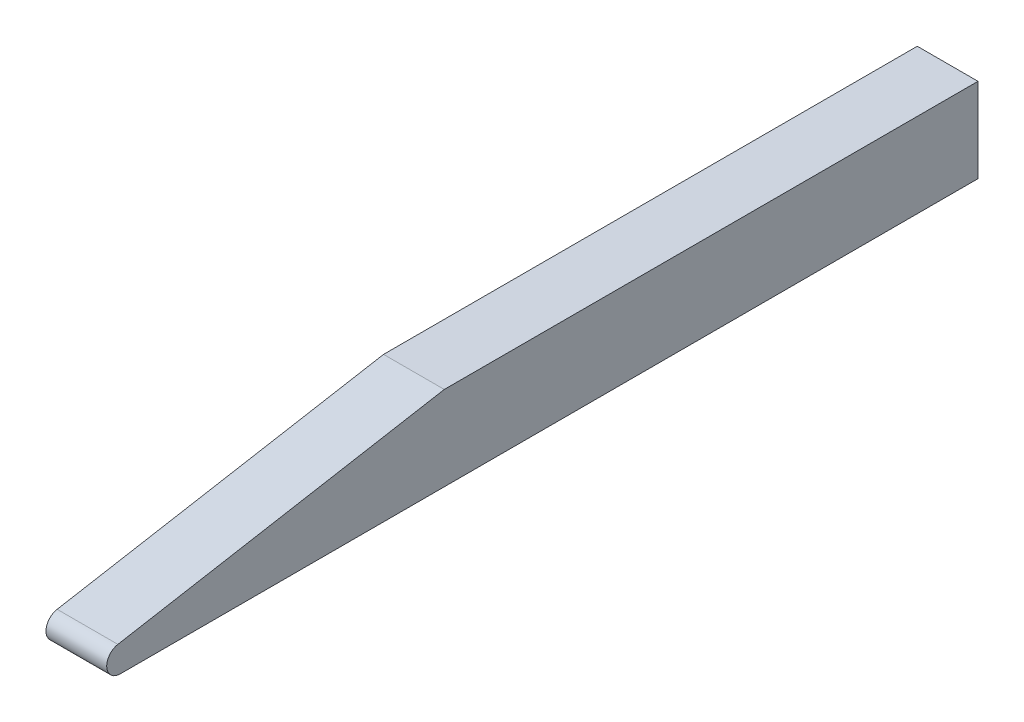
ISO-10303-21;
HEADER;
FILE_DESCRIPTION(('STEP AP214'),'2;1');
FILE_NAME('part.step','',(''),(''),'','','');
FILE_SCHEMA(('AUTOMOTIVE_DESIGN { 1 0 10303 214 1 1 1 1 }'));
ENDSEC;
DATA;
#1=APPLICATION_CONTEXT('core data for automotive mechanical design processes');
#2=APPLICATION_PROTOCOL_DEFINITION('international standard','automotive_design',2000,#1);
#3=PRODUCT_CONTEXT('',#1,'mechanical');
#4=PRODUCT('Part','Part','',(#3));
#5=PRODUCT_RELATED_PRODUCT_CATEGORY('part','',(#4));
#6=PRODUCT_DEFINITION_FORMATION('','',#4);
#7=PRODUCT_DEFINITION_CONTEXT('part definition',#1,'design');
#8=PRODUCT_DEFINITION('design','',#6,#7);
#9=PRODUCT_DEFINITION_SHAPE('','',#8);
#10=(LENGTH_UNIT() NAMED_UNIT(*) SI_UNIT(.MILLI.,.METRE.));
#11=(NAMED_UNIT(*) PLANE_ANGLE_UNIT() SI_UNIT($,.RADIAN.));
#12=(NAMED_UNIT(*) SI_UNIT($,.STERADIAN.) SOLID_ANGLE_UNIT());
#13=UNCERTAINTY_MEASURE_WITH_UNIT(LENGTH_MEASURE(1.E-05),#10,'distance_accuracy_value','');
#14=(GEOMETRIC_REPRESENTATION_CONTEXT(3) GLOBAL_UNCERTAINTY_ASSIGNED_CONTEXT((#13)) GLOBAL_UNIT_ASSIGNED_CONTEXT((#10,
#11,#12)) REPRESENTATION_CONTEXT('',''));
#15=CARTESIAN_POINT('',(0.,0.,0.));
#16=DIRECTION('',(0.,0.,1.));
#17=DIRECTION('',(1.,0.,0.));
#18=AXIS2_PLACEMENT_3D('',#15,#16,#17);
#19=CARTESIAN_POINT('',(0.45,0.,-15.));
#20=DIRECTION('',(0.,1.,0.));
#21=DIRECTION('',(0.,0.,1.));
#22=AXIS2_PLACEMENT_3D('',#19,#20,#21);
#23=PLANE('',#22);
#24=DIRECTION('',(0.,0.,-1.));
#25=VECTOR('',#24,1.);
#26=CARTESIAN_POINT('',(0.45,0.,-15.));
#27=LINE('',#26,#25);
#28=CARTESIAN_POINT('',(0.45,0.,-2.28601046055235));
#29=VERTEX_POINT('',#28);
#30=CARTESIAN_POINT('',(0.45,0.,-15.));
#31=VERTEX_POINT('',#30);
#32=EDGE_CURVE('E79',#29,#31,#27,.T.);
#33=ORIENTED_EDGE('',*,*,#32,.F.);
#34=DIRECTION('',(-1.,0.,0.));
#35=VECTOR('',#34,1.);
#36=CARTESIAN_POINT('',(0.45,0.,-2.28601046055235));
#37=LINE('',#36,#35);
#38=CARTESIAN_POINT('',(-0.45,0.,-2.28601046055235));
#39=VERTEX_POINT('',#38);
#40=EDGE_CURVE('E102',#29,#39,#37,.T.);
#41=ORIENTED_EDGE('',*,*,#40,.T.);
#42=DIRECTION('',(0.,0.,-1.));
#43=VECTOR('',#42,1.);
#44=CARTESIAN_POINT('',(-0.45,0.,-15.));
#45=LINE('',#44,#43);
#46=CARTESIAN_POINT('',(-0.45,0.,-15.));
#47=VERTEX_POINT('',#46);
#48=EDGE_CURVE('E100',#39,#47,#45,.T.);
#49=ORIENTED_EDGE('',*,*,#48,.T.);
#50=DIRECTION('',(-1.,0.,0.));
#51=VECTOR('',#50,1.);
#52=CARTESIAN_POINT('',(0.45,0.,-15.));
#53=LINE('',#52,#51);
#54=EDGE_CURVE('E94',#31,#47,#53,.T.);
#55=ORIENTED_EDGE('',*,*,#54,.F.);
#56=EDGE_LOOP('',(#33,#41,#49,#55));
#57=FACE_BOUND('',#56,.T.);
#58=ADVANCED_FACE('F33',(#57),#23,.F.);
#59=CARTESIAN_POINT('',(0.45,1.25,-15.));
#60=DIRECTION('',(0.,0.,1.));
#61=DIRECTION('',(1.,0.,0.));
#62=AXIS2_PLACEMENT_3D('',#59,#60,#61);
#63=PLANE('',#62);
#64=DIRECTION('',(0.,1.,0.));
#65=VECTOR('',#64,1.);
#66=CARTESIAN_POINT('',(-0.45,1.25,-15.));
#67=LINE('',#66,#65);
#68=CARTESIAN_POINT('',(-0.45,1.25,-15.));
#69=VERTEX_POINT('',#68);
#70=EDGE_CURVE('E115',#47,#69,#67,.T.);
#71=ORIENTED_EDGE('',*,*,#70,.T.);
#72=DIRECTION('',(-1.,0.,0.));
#73=VECTOR('',#72,1.);
#74=CARTESIAN_POINT('',(0.45,1.25,-15.));
#75=LINE('',#74,#73);
#76=CARTESIAN_POINT('',(0.45,1.25,-15.));
#77=VERTEX_POINT('',#76);
#78=EDGE_CURVE('E96',#77,#69,#75,.T.);
#79=ORIENTED_EDGE('',*,*,#78,.F.);
#80=DIRECTION('',(0.,1.,0.));
#81=VECTOR('',#80,1.);
#82=CARTESIAN_POINT('',(0.45,1.25,-15.));
#83=LINE('',#82,#81);
#84=EDGE_CURVE('E82',#31,#77,#83,.T.);
#85=ORIENTED_EDGE('',*,*,#84,.F.);
#86=ORIENTED_EDGE('',*,*,#54,.T.);
#87=EDGE_LOOP('',(#71,#79,#85,#86));
#88=FACE_BOUND('',#87,.T.);
#89=ADVANCED_FACE('F93',(#88),#63,.F.);
#90=CARTESIAN_POINT('',(0.45,1.25,-7.08910227452242));
#91=DIRECTION('',(0.,-1.,0.));
#92=DIRECTION('',(0.,0.,-1.));
#93=AXIS2_PLACEMENT_3D('',#90,#91,#92);
#94=PLANE('',#93);
#95=DIRECTION('',(0.,0.,1.));
#96=VECTOR('',#95,1.);
#97=CARTESIAN_POINT('',(-0.45,1.25,-7.08910227452242));
#98=LINE('',#97,#96);
#99=CARTESIAN_POINT('',(-0.45,1.25,-7.08910227452242));
#100=VERTEX_POINT('',#99);
#101=EDGE_CURVE('E113',#69,#100,#98,.T.);
#102=ORIENTED_EDGE('',*,*,#101,.T.);
#103=DIRECTION('',(-1.,0.,0.));
#104=VECTOR('',#103,1.);
#105=CARTESIAN_POINT('',(0.45,1.25,-7.08910227452242));
#106=LINE('',#105,#104);
#107=CARTESIAN_POINT('',(0.45,1.25,-7.08910227452242));
#108=VERTEX_POINT('',#107);
#109=EDGE_CURVE('E105',#108,#100,#106,.T.);
#110=ORIENTED_EDGE('',*,*,#109,.F.);
#111=DIRECTION('',(0.,0.,1.));
#112=VECTOR('',#111,1.);
#113=CARTESIAN_POINT('',(0.45,1.25,-7.08910227452242));
#114=LINE('',#113,#112);
#115=EDGE_CURVE('E98',#77,#108,#114,.T.);
#116=ORIENTED_EDGE('',*,*,#115,.F.);
#117=ORIENTED_EDGE('',*,*,#78,.T.);
#118=EDGE_LOOP('',(#102,#110,#116,#117));
#119=FACE_BOUND('',#118,.T.);
#120=ADVANCED_FACE('F121',(#119),#94,.F.);
#121=CARTESIAN_POINT('',(0.45,0.,0.));
#122=DIRECTION('',(0.,-0.984807753012209,-0.173648177666924));
#123=DIRECTION('',(0.,0.173648177666924,-0.984807753012209));
#124=AXIS2_PLACEMENT_3D('',#121,#122,#123);
#125=PLANE('',#124);
#126=DIRECTION('',(0.,-0.173648177666924,0.984807753012209));
#127=VECTOR('',#126,1.);
#128=CARTESIAN_POINT('',(-0.45,0.,0.));
#129=LINE('',#128,#127);
#130=CARTESIAN_POINT('',(-0.45,0.396961550602442,-2.25128082501897));
#131=VERTEX_POINT('',#130);
#132=EDGE_CURVE('E89',#100,#131,#129,.T.);
#133=ORIENTED_EDGE('',*,*,#132,.T.);
#134=DIRECTION('',(-1.,0.,0.));
#135=VECTOR('',#134,1.);
#136=CARTESIAN_POINT('',(0.45,0.396961550602441,-2.25128082501897));
#137=LINE('',#136,#135);
#138=CARTESIAN_POINT('',(0.45,0.396961550602442,-2.25128082501897));
#139=VERTEX_POINT('',#138);
#140=EDGE_CURVE('E41',#131,#139,#137,.F.);
#141=ORIENTED_EDGE('',*,*,#140,.T.);
#142=DIRECTION('',(0.,-0.173648177666924,0.984807753012209));
#143=VECTOR('',#142,1.);
#144=CARTESIAN_POINT('',(0.45,0.,0.));
#145=LINE('',#144,#143);
#146=EDGE_CURVE('E111',#108,#139,#145,.T.);
#147=ORIENTED_EDGE('',*,*,#146,.F.);
#148=ORIENTED_EDGE('',*,*,#109,.T.);
#149=EDGE_LOOP('',(#133,#141,#147,#148));
#150=FACE_BOUND('',#149,.T.);
#151=ADVANCED_FACE('F123',(#150),#125,.F.);
#152=CARTESIAN_POINT('',(0.45,0.,0.));
#153=DIRECTION('',(1.,0.,0.));
#154=DIRECTION('',(0.,0.,-1.));
#155=AXIS2_PLACEMENT_3D('',#152,#153,#154);
#156=PLANE('',#155);
#157=ORIENTED_EDGE('',*,*,#146,.T.);
#158=CARTESIAN_POINT('',(0.45,0.2,-2.28601046055235));
#159=DIRECTION('',(1.,0.,0.));
#160=DIRECTION('',(0.,0.,-1.));
#161=AXIS2_PLACEMENT_3D('',#158,#159,#160);
#162=CIRCLE('',#161,0.2);
#163=EDGE_CURVE('E11',#139,#29,#162,.T.);
#164=ORIENTED_EDGE('',*,*,#163,.T.);
#165=ORIENTED_EDGE('',*,*,#32,.T.);
#166=ORIENTED_EDGE('',*,*,#84,.T.);
#167=ORIENTED_EDGE('',*,*,#115,.T.);
#168=EDGE_LOOP('',(#157,#164,#165,#166,#167));
#169=FACE_BOUND('',#168,.T.);
#170=ADVANCED_FACE('F81',(#169),#156,.T.);
#171=CARTESIAN_POINT('',(-0.45,0.,0.));
#172=DIRECTION('',(1.,0.,0.));
#173=DIRECTION('',(0.,0.,-1.));
#174=AXIS2_PLACEMENT_3D('',#171,#172,#173);
#175=PLANE('',#174);
#176=ORIENTED_EDGE('',*,*,#48,.F.);
#177=CARTESIAN_POINT('',(-0.45,0.2,-2.28601046055235));
#178=DIRECTION('',(1.,0.,0.));
#179=DIRECTION('',(0.,0.,-1.));
#180=AXIS2_PLACEMENT_3D('',#177,#178,#179);
#181=CIRCLE('',#180,0.2);
#182=EDGE_CURVE('E55',#39,#131,#181,.F.);
#183=ORIENTED_EDGE('',*,*,#182,.T.);
#184=ORIENTED_EDGE('',*,*,#132,.F.);
#185=ORIENTED_EDGE('',*,*,#101,.F.);
#186=ORIENTED_EDGE('',*,*,#70,.F.);
#187=EDGE_LOOP('',(#176,#183,#184,#185,#186));
#188=FACE_BOUND('',#187,.T.);
#189=ADVANCED_FACE('F130',(#188),#175,.F.);
#190=CARTESIAN_POINT('',(0.45,0.2,-2.28601046055235));
#191=DIRECTION('',(-1.,0.,0.));
#192=DIRECTION('',(0.,0.,1.));
#193=AXIS2_PLACEMENT_3D('',#190,#191,#192);
#194=CYLINDRICAL_SURFACE('',#193,0.2);
#195=ORIENTED_EDGE('',*,*,#163,.F.);
#196=ORIENTED_EDGE('',*,*,#140,.F.);
#197=ORIENTED_EDGE('',*,*,#182,.F.);
#198=ORIENTED_EDGE('',*,*,#40,.F.);
#199=EDGE_LOOP('',(#195,#196,#197,#198));
#200=FACE_BOUND('',#199,.T.);
#201=ADVANCED_FACE('F35',(#200),#194,.T.);
#202=CLOSED_SHELL('',(#58,#89,#120,#151,#170,#189,#201));
#203=MANIFOLD_SOLID_BREP('B2',#202);
#204=ADVANCED_BREP_SHAPE_REPRESENTATION('',(#18,#203),#14);
#205=SHAPE_DEFINITION_REPRESENTATION(#9,#204);
ENDSEC;
END-ISO-10303-21;
